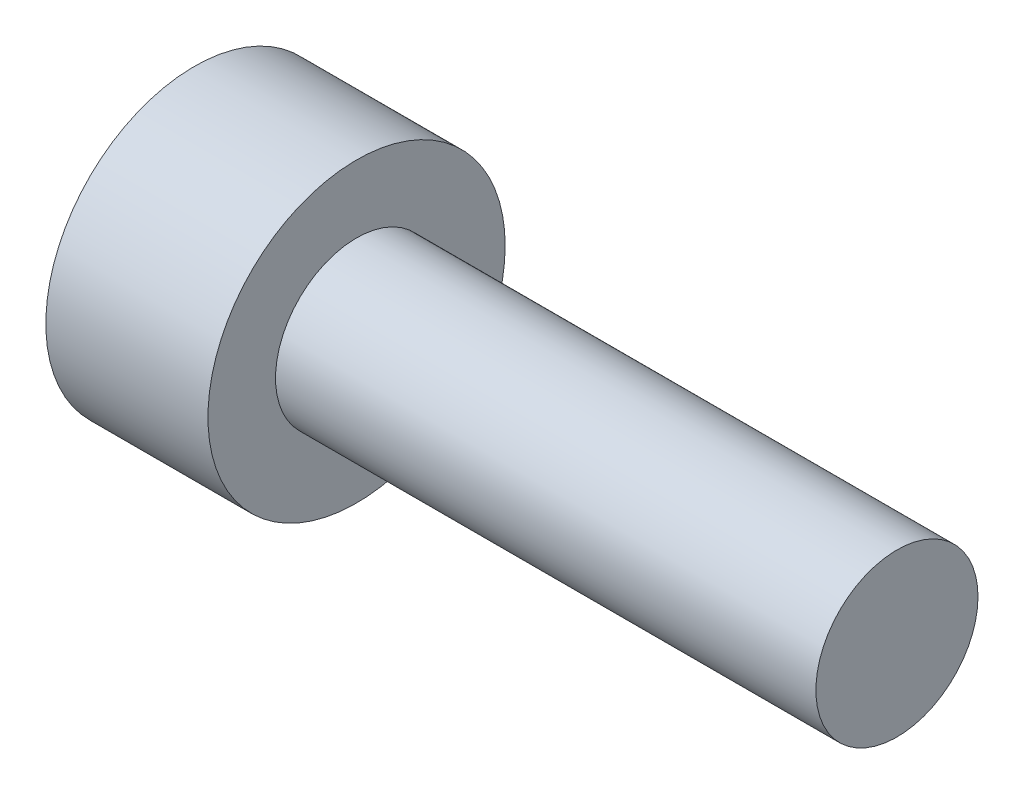
ISO-10303-21;
HEADER;
FILE_DESCRIPTION(('STEP AP214'),'2;1');
FILE_NAME('part.step','',(''),(''),'','','');
FILE_SCHEMA(('AUTOMOTIVE_DESIGN { 1 0 10303 214 1 1 1 1 }'));
ENDSEC;
DATA;
#1=APPLICATION_CONTEXT('core data for automotive mechanical design processes');
#2=APPLICATION_PROTOCOL_DEFINITION('international standard','automotive_design',2000,#1);
#3=PRODUCT_CONTEXT('',#1,'mechanical');
#4=PRODUCT('Part','Part','',(#3));
#5=PRODUCT_RELATED_PRODUCT_CATEGORY('part','',(#4));
#6=PRODUCT_DEFINITION_FORMATION('','',#4);
#7=PRODUCT_DEFINITION_CONTEXT('part definition',#1,'design');
#8=PRODUCT_DEFINITION('design','',#6,#7);
#9=PRODUCT_DEFINITION_SHAPE('','',#8);
#10=(LENGTH_UNIT() NAMED_UNIT(*) SI_UNIT(.MILLI.,.METRE.));
#11=(NAMED_UNIT(*) PLANE_ANGLE_UNIT() SI_UNIT($,.RADIAN.));
#12=(NAMED_UNIT(*) SI_UNIT($,.STERADIAN.) SOLID_ANGLE_UNIT());
#13=UNCERTAINTY_MEASURE_WITH_UNIT(LENGTH_MEASURE(1.E-05),#10,'distance_accuracy_value','');
#14=(GEOMETRIC_REPRESENTATION_CONTEXT(3) GLOBAL_UNCERTAINTY_ASSIGNED_CONTEXT((#13)) GLOBAL_UNIT_ASSIGNED_CONTEXT((#10,
#11,#12)) REPRESENTATION_CONTEXT('',''));
#15=CARTESIAN_POINT('',(0.,0.,0.));
#16=DIRECTION('',(0.,0.,1.));
#17=DIRECTION('',(1.,0.,0.));
#18=AXIS2_PLACEMENT_3D('',#15,#16,#17);
#19=CARTESIAN_POINT('',(3.,0.,0.));
#20=DIRECTION('',(-1.,0.,0.));
#21=DIRECTION('',(0.,0.,1.));
#22=AXIS2_PLACEMENT_3D('',#19,#20,#21);
#23=CYLINDRICAL_SURFACE('',#22,2.75);
#24=CARTESIAN_POINT('',(3.,0.,0.));
#25=DIRECTION('',(1.,0.,0.));
#26=DIRECTION('',(0.,0.,-1.));
#27=AXIS2_PLACEMENT_3D('',#24,#25,#26);
#28=CIRCLE('',#27,2.75);
#29=CARTESIAN_POINT('',(3.,0.,-2.75));
#30=VERTEX_POINT('',#29);
#31=EDGE_CURVE('E46',#30,#30,#28,.T.);
#32=ORIENTED_EDGE('',*,*,#31,.F.);
#33=EDGE_LOOP('',(#32));
#34=FACE_BOUND('',#33,.T.);
#35=CARTESIAN_POINT('',(0.,0.,0.));
#36=DIRECTION('',(1.,0.,0.));
#37=DIRECTION('',(0.,0.,-1.));
#38=AXIS2_PLACEMENT_3D('',#35,#36,#37);
#39=CIRCLE('',#38,2.75);
#40=CARTESIAN_POINT('',(0.,0.,-2.75));
#41=VERTEX_POINT('',#40);
#42=EDGE_CURVE('E45',#41,#41,#39,.T.);
#43=ORIENTED_EDGE('',*,*,#42,.T.);
#44=EDGE_LOOP('',(#43));
#45=FACE_BOUND('',#44,.T.);
#46=ADVANCED_FACE('F39',(#34,#45),#23,.T.);
#47=CARTESIAN_POINT('',(3.,0.,0.));
#48=DIRECTION('',(1.,0.,0.));
#49=DIRECTION('',(0.,0.,-1.));
#50=AXIS2_PLACEMENT_3D('',#47,#48,#49);
#51=PLANE('',#50);
#52=CARTESIAN_POINT('',(3.,0.,0.));
#53=DIRECTION('',(1.,0.,0.));
#54=DIRECTION('',(0.,0.,-1.));
#55=AXIS2_PLACEMENT_3D('',#52,#53,#54);
#56=CIRCLE('',#55,1.5);
#57=CARTESIAN_POINT('',(3.,0.,-1.5));
#58=VERTEX_POINT('',#57);
#59=EDGE_CURVE('E10',#58,#58,#56,.T.);
#60=ORIENTED_EDGE('',*,*,#59,.F.);
#61=EDGE_LOOP('',(#60));
#62=FACE_BOUND('',#61,.T.);
#63=ORIENTED_EDGE('',*,*,#31,.T.);
#64=EDGE_LOOP('',(#63));
#65=FACE_BOUND('',#64,.T.);
#66=ADVANCED_FACE('F64',(#62,#65),#51,.T.);
#67=CARTESIAN_POINT('',(0.,0.,0.));
#68=DIRECTION('',(1.,0.,0.));
#69=DIRECTION('',(0.,0.,-1.));
#70=AXIS2_PLACEMENT_3D('',#67,#68,#69);
#71=PLANE('',#70);
#72=ORIENTED_EDGE('',*,*,#42,.F.);
#73=EDGE_LOOP('',(#72));
#74=FACE_BOUND('',#73,.T.);
#75=ADVANCED_FACE('F58',(#74),#71,.F.);
#76=CARTESIAN_POINT('',(13.,0.,0.));
#77=DIRECTION('',(-1.,0.,0.));
#78=DIRECTION('',(0.,0.,1.));
#79=AXIS2_PLACEMENT_3D('',#76,#77,#78);
#80=CYLINDRICAL_SURFACE('',#79,1.5);
#81=CARTESIAN_POINT('',(13.,0.,0.));
#82=DIRECTION('',(1.,0.,0.));
#83=DIRECTION('',(0.,0.,-1.));
#84=AXIS2_PLACEMENT_3D('',#81,#82,#83);
#85=CIRCLE('',#84,1.5);
#86=CARTESIAN_POINT('',(13.,0.,-1.5));
#87=VERTEX_POINT('',#86);
#88=EDGE_CURVE('E55',#87,#87,#85,.T.);
#89=ORIENTED_EDGE('',*,*,#88,.F.);
#90=EDGE_LOOP('',(#89));
#91=FACE_BOUND('',#90,.T.);
#92=ORIENTED_EDGE('',*,*,#59,.T.);
#93=EDGE_LOOP('',(#92));
#94=FACE_BOUND('',#93,.T.);
#95=ADVANCED_FACE('F65',(#91,#94),#80,.T.);
#96=CARTESIAN_POINT('',(13.,0.,0.));
#97=DIRECTION('',(1.,0.,0.));
#98=DIRECTION('',(0.,0.,-1.));
#99=AXIS2_PLACEMENT_3D('',#96,#97,#98);
#100=PLANE('',#99);
#101=ORIENTED_EDGE('',*,*,#88,.T.);
#102=EDGE_LOOP('',(#101));
#103=FACE_BOUND('',#102,.T.);
#104=ADVANCED_FACE('F68',(#103),#100,.T.);
#105=CLOSED_SHELL('',(#46,#66,#75,#95,#104));
#106=MANIFOLD_SOLID_BREP('B2',#105);
#107=ADVANCED_BREP_SHAPE_REPRESENTATION('',(#18,#106),#14);
#108=SHAPE_DEFINITION_REPRESENTATION(#9,#107);
ENDSEC;
END-ISO-10303-21;
